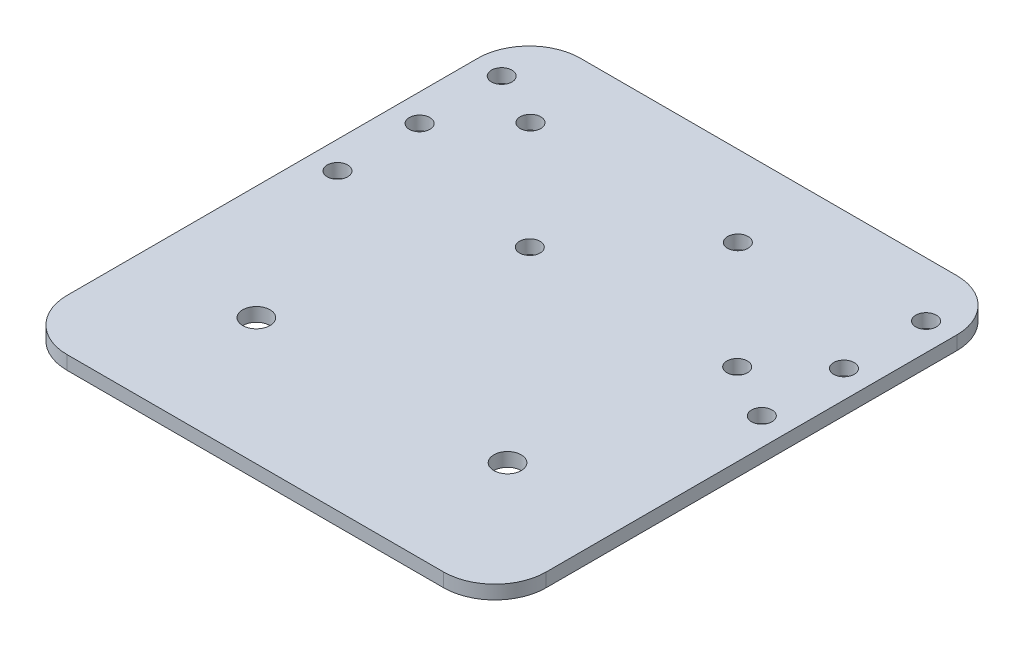
ISO-10303-21;
HEADER;
FILE_DESCRIPTION(('STEP AP214'),'2;1');
FILE_NAME('part.step','',(''),(''),'','','');
FILE_SCHEMA(('AUTOMOTIVE_DESIGN { 1 0 10303 214 1 1 1 1 }'));
ENDSEC;
DATA;
#1=APPLICATION_CONTEXT('core data for automotive mechanical design processes');
#2=APPLICATION_PROTOCOL_DEFINITION('international standard','automotive_design',2000,#1);
#3=PRODUCT_CONTEXT('',#1,'mechanical');
#4=PRODUCT('Part','Part','',(#3));
#5=PRODUCT_RELATED_PRODUCT_CATEGORY('part','',(#4));
#6=PRODUCT_DEFINITION_FORMATION('','',#4);
#7=PRODUCT_DEFINITION_CONTEXT('part definition',#1,'design');
#8=PRODUCT_DEFINITION('design','',#6,#7);
#9=PRODUCT_DEFINITION_SHAPE('','',#8);
#10=(LENGTH_UNIT() NAMED_UNIT(*) SI_UNIT(.MILLI.,.METRE.));
#11=(NAMED_UNIT(*) PLANE_ANGLE_UNIT() SI_UNIT($,.RADIAN.));
#12=(NAMED_UNIT(*) SI_UNIT($,.STERADIAN.) SOLID_ANGLE_UNIT());
#13=UNCERTAINTY_MEASURE_WITH_UNIT(LENGTH_MEASURE(1.E-05),#10,'distance_accuracy_value','');
#14=(GEOMETRIC_REPRESENTATION_CONTEXT(3) GLOBAL_UNCERTAINTY_ASSIGNED_CONTEXT((#13)) GLOBAL_UNIT_ASSIGNED_CONTEXT((#10,
#11,#12)) REPRESENTATION_CONTEXT('',''));
#15=CARTESIAN_POINT('',(0.,0.,0.));
#16=DIRECTION('',(0.,0.,1.));
#17=DIRECTION('',(1.,0.,0.));
#18=AXIS2_PLACEMENT_3D('',#15,#16,#17);
#19=CARTESIAN_POINT('',(0.,2.,0.));
#20=DIRECTION('',(0.,1.,0.));
#21=DIRECTION('',(0.,0.,1.));
#22=AXIS2_PLACEMENT_3D('',#19,#20,#21);
#23=PLANE('',#22);
#24=CARTESIAN_POINT('',(18.35,2.,20.));
#25=DIRECTION('',(0.,1.,0.));
#26=DIRECTION('',(0.,0.,1.));
#27=AXIS2_PLACEMENT_3D('',#24,#25,#26);
#28=CIRCLE('',#27,2.);
#29=CARTESIAN_POINT('',(18.35,2.,22.));
#30=VERTEX_POINT('',#29);
#31=EDGE_CURVE('E277',#30,#30,#28,.T.);
#32=ORIENTED_EDGE('',*,*,#31,.F.);
#33=EDGE_LOOP('',(#32));
#34=FACE_BOUND('',#33,.T.);
#35=CARTESIAN_POINT('',(-31.,2.,-16.5));
#36=DIRECTION('',(0.,1.,0.));
#37=DIRECTION('',(0.,0.,-1.));
#38=AXIS2_PLACEMENT_3D('',#35,#36,#37);
#39=CIRCLE('',#38,1.5);
#40=CARTESIAN_POINT('',(-31.,2.,-18.));
#41=VERTEX_POINT('',#40);
#42=EDGE_CURVE('E261',#41,#41,#39,.T.);
#43=ORIENTED_EDGE('',*,*,#42,.F.);
#44=EDGE_LOOP('',(#43));
#45=FACE_BOUND('',#44,.T.);
#46=CARTESIAN_POINT('',(31.,2.,-4.5));
#47=DIRECTION('',(0.,1.,0.));
#48=DIRECTION('',(0.,0.,1.));
#49=AXIS2_PLACEMENT_3D('',#46,#47,#48);
#50=CIRCLE('',#49,1.5);
#51=CARTESIAN_POINT('',(31.,2.,-3.));
#52=VERTEX_POINT('',#51);
#53=EDGE_CURVE('E245',#52,#52,#50,.T.);
#54=ORIENTED_EDGE('',*,*,#53,.F.);
#55=EDGE_LOOP('',(#54));
#56=FACE_BOUND('',#55,.T.);
#57=CARTESIAN_POINT('',(31.,2.,-16.5));
#58=DIRECTION('',(0.,1.,0.));
#59=DIRECTION('',(0.,0.,1.));
#60=AXIS2_PLACEMENT_3D('',#57,#58,#59);
#61=CIRCLE('',#60,1.5);
#62=CARTESIAN_POINT('',(31.,2.,-15.));
#63=VERTEX_POINT('',#62);
#64=EDGE_CURVE('E229',#63,#63,#61,.T.);
#65=ORIENTED_EDGE('',*,*,#64,.F.);
#66=EDGE_LOOP('',(#65));
#67=FACE_BOUND('',#66,.T.);
#68=CARTESIAN_POINT('',(-23.,2.,-24.7));
#69=DIRECTION('',(0.,1.,0.));
#70=DIRECTION('',(0.,0.,1.));
#71=AXIS2_PLACEMENT_3D('',#68,#69,#70);
#72=CIRCLE('',#71,1.5);
#73=CARTESIAN_POINT('',(-23.,2.,-23.2));
#74=VERTEX_POINT('',#73);
#75=EDGE_CURVE('E213',#74,#74,#72,.T.);
#76=ORIENTED_EDGE('',*,*,#75,.F.);
#77=EDGE_LOOP('',(#76));
#78=FACE_BOUND('',#77,.T.);
#79=CARTESIAN_POINT('',(7.3,2.,-24.7));
#80=DIRECTION('',(0.,1.,0.));
#81=DIRECTION('',(0.,0.,1.));
#82=AXIS2_PLACEMENT_3D('',#79,#80,#81);
#83=CIRCLE('',#82,1.5);
#84=CARTESIAN_POINT('',(7.3,2.,-23.2));
#85=VERTEX_POINT('',#84);
#86=EDGE_CURVE('E197',#85,#85,#83,.T.);
#87=ORIENTED_EDGE('',*,*,#86,.F.);
#88=EDGE_LOOP('',(#87));
#89=FACE_BOUND('',#88,.T.);
#90=DIRECTION('',(1.,0.,0.));
#91=VECTOR('',#90,1.);
#92=CARTESIAN_POINT('',(-35.,2.,38.5));
#93=LINE('',#92,#91);
#94=CARTESIAN_POINT('',(-27.5,2.,38.5));
#95=VERTEX_POINT('',#94);
#96=CARTESIAN_POINT('',(27.5,2.,38.5));
#97=VERTEX_POINT('',#96);
#98=EDGE_CURVE('E183',#95,#97,#93,.T.);
#99=ORIENTED_EDGE('',*,*,#98,.T.);
#100=CARTESIAN_POINT('',(27.5,2.,31.));
#101=DIRECTION('',(0.,1.,0.));
#102=DIRECTION('',(0.,0.,1.));
#103=AXIS2_PLACEMENT_3D('',#100,#101,#102);
#104=CIRCLE('',#103,7.5);
#105=CARTESIAN_POINT('',(35.,2.,31.));
#106=VERTEX_POINT('',#105);
#107=EDGE_CURVE('E169',#97,#106,#104,.T.);
#108=ORIENTED_EDGE('',*,*,#107,.T.);
#109=DIRECTION('',(0.,0.,-1.));
#110=VECTOR('',#109,1.);
#111=CARTESIAN_POINT('',(35.,2.,-36.5));
#112=LINE('',#111,#110);
#113=CARTESIAN_POINT('',(35.,2.,-29.));
#114=VERTEX_POINT('',#113);
#115=EDGE_CURVE('E126',#106,#114,#112,.T.);
#116=ORIENTED_EDGE('',*,*,#115,.T.);
#117=CARTESIAN_POINT('',(27.5,2.,-29.));
#118=DIRECTION('',(0.,1.,0.));
#119=DIRECTION('',(0.,0.,1.));
#120=AXIS2_PLACEMENT_3D('',#117,#118,#119);
#121=CIRCLE('',#120,7.5);
#122=CARTESIAN_POINT('',(27.5,2.,-36.5));
#123=VERTEX_POINT('',#122);
#124=EDGE_CURVE('E61',#114,#123,#121,.T.);
#125=ORIENTED_EDGE('',*,*,#124,.T.);
#126=DIRECTION('',(-1.,0.,0.));
#127=VECTOR('',#126,1.);
#128=CARTESIAN_POINT('',(35.,2.,-36.5));
#129=LINE('',#128,#127);
#130=CARTESIAN_POINT('',(-27.5,2.,-36.5));
#131=VERTEX_POINT('',#130);
#132=EDGE_CURVE('E148',#123,#131,#129,.T.);
#133=ORIENTED_EDGE('',*,*,#132,.T.);
#134=CARTESIAN_POINT('',(-27.5,2.,-29.));
#135=DIRECTION('',(0.,1.,0.));
#136=DIRECTION('',(0.,0.,1.));
#137=AXIS2_PLACEMENT_3D('',#134,#135,#136);
#138=CIRCLE('',#137,7.5);
#139=CARTESIAN_POINT('',(-35.,2.,-29.));
#140=VERTEX_POINT('',#139);
#141=EDGE_CURVE('E161',#131,#140,#138,.T.);
#142=ORIENTED_EDGE('',*,*,#141,.T.);
#143=DIRECTION('',(0.,0.,1.));
#144=VECTOR('',#143,1.);
#145=CARTESIAN_POINT('',(-35.,2.,-36.5));
#146=LINE('',#145,#144);
#147=CARTESIAN_POINT('',(-35.,2.,31.));
#148=VERTEX_POINT('',#147);
#149=EDGE_CURVE('E141',#140,#148,#146,.T.);
#150=ORIENTED_EDGE('',*,*,#149,.T.);
#151=CARTESIAN_POINT('',(-27.5,2.,31.));
#152=DIRECTION('',(0.,1.,0.));
#153=DIRECTION('',(0.,0.,1.));
#154=AXIS2_PLACEMENT_3D('',#151,#152,#153);
#155=CIRCLE('',#154,7.5);
#156=EDGE_CURVE('E166',#148,#95,#155,.T.);
#157=ORIENTED_EDGE('',*,*,#156,.T.);
#158=EDGE_LOOP('',(#99,#108,#116,#125,#133,#142,#150,#157));
#159=FACE_BOUND('',#158,.T.);
#160=CARTESIAN_POINT('',(23.,2.,-8.9));
#161=DIRECTION('',(0.,1.,0.));
#162=DIRECTION('',(0.,0.,1.));
#163=AXIS2_PLACEMENT_3D('',#160,#161,#162);
#164=CIRCLE('',#163,1.5);
#165=CARTESIAN_POINT('',(23.,2.,-7.4));
#166=VERTEX_POINT('',#165);
#167=EDGE_CURVE('E207',#166,#166,#164,.T.);
#168=ORIENTED_EDGE('',*,*,#167,.F.);
#169=EDGE_LOOP('',(#168));
#170=FACE_BOUND('',#169,.T.);
#171=CARTESIAN_POINT('',(-7.3,2.,-8.9));
#172=DIRECTION('',(0.,1.,0.));
#173=DIRECTION('',(0.,0.,1.));
#174=AXIS2_PLACEMENT_3D('',#171,#172,#173);
#175=CIRCLE('',#174,1.5);
#176=CARTESIAN_POINT('',(-7.3,2.,-7.4));
#177=VERTEX_POINT('',#176);
#178=EDGE_CURVE('E221',#177,#177,#175,.T.);
#179=ORIENTED_EDGE('',*,*,#178,.F.);
#180=EDGE_LOOP('',(#179));
#181=FACE_BOUND('',#180,.T.);
#182=CARTESIAN_POINT('',(31.,2.,-28.5));
#183=DIRECTION('',(0.,1.,0.));
#184=DIRECTION('',(0.,0.,1.));
#185=AXIS2_PLACEMENT_3D('',#182,#183,#184);
#186=CIRCLE('',#185,1.5);
#187=CARTESIAN_POINT('',(31.,2.,-27.));
#188=VERTEX_POINT('',#187);
#189=EDGE_CURVE('E237',#188,#188,#186,.T.);
#190=ORIENTED_EDGE('',*,*,#189,.F.);
#191=EDGE_LOOP('',(#190));
#192=FACE_BOUND('',#191,.T.);
#193=CARTESIAN_POINT('',(-31.,2.,-28.5));
#194=DIRECTION('',(0.,1.,0.));
#195=DIRECTION('',(0.,0.,-1.));
#196=AXIS2_PLACEMENT_3D('',#193,#194,#195);
#197=CIRCLE('',#196,1.5);
#198=CARTESIAN_POINT('',(-31.,2.,-30.));
#199=VERTEX_POINT('',#198);
#200=EDGE_CURVE('E253',#199,#199,#197,.T.);
#201=ORIENTED_EDGE('',*,*,#200,.F.);
#202=EDGE_LOOP('',(#201));
#203=FACE_BOUND('',#202,.T.);
#204=CARTESIAN_POINT('',(-31.,2.,-4.5));
#205=DIRECTION('',(0.,1.,0.));
#206=DIRECTION('',(0.,0.,-1.));
#207=AXIS2_PLACEMENT_3D('',#204,#205,#206);
#208=CIRCLE('',#207,1.5);
#209=CARTESIAN_POINT('',(-31.,2.,-6.));
#210=VERTEX_POINT('',#209);
#211=EDGE_CURVE('E269',#210,#210,#208,.T.);
#212=ORIENTED_EDGE('',*,*,#211,.F.);
#213=EDGE_LOOP('',(#212));
#214=FACE_BOUND('',#213,.T.);
#215=CARTESIAN_POINT('',(-18.35,2.,20.));
#216=DIRECTION('',(0.,1.,0.));
#217=DIRECTION('',(0.,0.,-1.));
#218=AXIS2_PLACEMENT_3D('',#215,#216,#217);
#219=CIRCLE('',#218,2.);
#220=CARTESIAN_POINT('',(-18.35,2.,18.));
#221=VERTEX_POINT('',#220);
#222=EDGE_CURVE('E285',#221,#221,#219,.T.);
#223=ORIENTED_EDGE('',*,*,#222,.F.);
#224=EDGE_LOOP('',(#223));
#225=FACE_BOUND('',#224,.T.);
#226=ADVANCED_FACE('F39',(#34,#45,#56,#67,#78,#89,#159,#170,#181,#192,#203,#214,#225),#23,.T.);
#227=CARTESIAN_POINT('',(0.,0.,0.));
#228=DIRECTION('',(0.,1.,0.));
#229=DIRECTION('',(0.,0.,1.));
#230=AXIS2_PLACEMENT_3D('',#227,#228,#229);
#231=PLANE('',#230);
#232=DIRECTION('',(0.,0.,-1.));
#233=VECTOR('',#232,1.);
#234=CARTESIAN_POINT('',(35.,0.,-36.5));
#235=LINE('',#234,#233);
#236=CARTESIAN_POINT('',(35.,0.,31.));
#237=VERTEX_POINT('',#236);
#238=CARTESIAN_POINT('',(35.,0.,-29.));
#239=VERTEX_POINT('',#238);
#240=EDGE_CURVE('E124',#237,#239,#235,.T.);
#241=ORIENTED_EDGE('',*,*,#240,.F.);
#242=CARTESIAN_POINT('',(27.5,0.,31.));
#243=DIRECTION('',(0.,1.,0.));
#244=DIRECTION('',(0.,0.,1.));
#245=AXIS2_PLACEMENT_3D('',#242,#243,#244);
#246=CIRCLE('',#245,7.5);
#247=CARTESIAN_POINT('',(27.5,0.,38.5));
#248=VERTEX_POINT('',#247);
#249=EDGE_CURVE('E106',#237,#248,#246,.F.);
#250=ORIENTED_EDGE('',*,*,#249,.T.);
#251=DIRECTION('',(1.,0.,0.));
#252=VECTOR('',#251,1.);
#253=CARTESIAN_POINT('',(-35.,0.,38.5));
#254=LINE('',#253,#252);
#255=CARTESIAN_POINT('',(-27.5,0.,38.5));
#256=VERTEX_POINT('',#255);
#257=EDGE_CURVE('E137',#256,#248,#254,.T.);
#258=ORIENTED_EDGE('',*,*,#257,.F.);
#259=CARTESIAN_POINT('',(-27.5,0.,31.));
#260=DIRECTION('',(0.,1.,0.));
#261=DIRECTION('',(0.,0.,1.));
#262=AXIS2_PLACEMENT_3D('',#259,#260,#261);
#263=CIRCLE('',#262,7.5);
#264=CARTESIAN_POINT('',(-35.,0.,31.));
#265=VERTEX_POINT('',#264);
#266=EDGE_CURVE('E118',#256,#265,#263,.F.);
#267=ORIENTED_EDGE('',*,*,#266,.T.);
#268=DIRECTION('',(0.,0.,1.));
#269=VECTOR('',#268,1.);
#270=CARTESIAN_POINT('',(-35.,0.,-36.5));
#271=LINE('',#270,#269);
#272=CARTESIAN_POINT('',(-35.,0.,-29.));
#273=VERTEX_POINT('',#272);
#274=EDGE_CURVE('E143',#273,#265,#271,.T.);
#275=ORIENTED_EDGE('',*,*,#274,.F.);
#276=CARTESIAN_POINT('',(-27.5,0.,-29.));
#277=DIRECTION('',(0.,1.,0.));
#278=DIRECTION('',(0.,0.,1.));
#279=AXIS2_PLACEMENT_3D('',#276,#277,#278);
#280=CIRCLE('',#279,7.5);
#281=CARTESIAN_POINT('',(-27.5,0.,-36.5));
#282=VERTEX_POINT('',#281);
#283=EDGE_CURVE('E128',#273,#282,#280,.F.);
#284=ORIENTED_EDGE('',*,*,#283,.T.);
#285=DIRECTION('',(-1.,0.,0.));
#286=VECTOR('',#285,1.);
#287=CARTESIAN_POINT('',(35.,0.,-36.5));
#288=LINE('',#287,#286);
#289=CARTESIAN_POINT('',(27.5,0.,-36.5));
#290=VERTEX_POINT('',#289);
#291=EDGE_CURVE('E136',#290,#282,#288,.T.);
#292=ORIENTED_EDGE('',*,*,#291,.F.);
#293=CARTESIAN_POINT('',(27.5,0.,-29.));
#294=DIRECTION('',(0.,1.,0.));
#295=DIRECTION('',(0.,0.,1.));
#296=AXIS2_PLACEMENT_3D('',#293,#294,#295);
#297=CIRCLE('',#296,7.5);
#298=EDGE_CURVE('E134',#290,#239,#297,.F.);
#299=ORIENTED_EDGE('',*,*,#298,.T.);
#300=EDGE_LOOP('',(#241,#250,#258,#267,#275,#284,#292,#299));
#301=FACE_BOUND('',#300,.T.);
#302=CARTESIAN_POINT('',(7.3,0.,-24.7));
#303=DIRECTION('',(0.,1.,0.));
#304=DIRECTION('',(0.,0.,1.));
#305=AXIS2_PLACEMENT_3D('',#302,#303,#304);
#306=CIRCLE('',#305,1.5);
#307=CARTESIAN_POINT('',(7.3,0.,-23.2));
#308=VERTEX_POINT('',#307);
#309=EDGE_CURVE('E193',#308,#308,#306,.T.);
#310=ORIENTED_EDGE('',*,*,#309,.T.);
#311=EDGE_LOOP('',(#310));
#312=FACE_BOUND('',#311,.T.);
#313=CARTESIAN_POINT('',(23.,0.,-8.9));
#314=DIRECTION('',(0.,1.,0.));
#315=DIRECTION('',(0.,0.,1.));
#316=AXIS2_PLACEMENT_3D('',#313,#314,#315);
#317=CIRCLE('',#316,1.5);
#318=CARTESIAN_POINT('',(23.,0.,-7.4));
#319=VERTEX_POINT('',#318);
#320=EDGE_CURVE('E209',#319,#319,#317,.T.);
#321=ORIENTED_EDGE('',*,*,#320,.T.);
#322=EDGE_LOOP('',(#321));
#323=FACE_BOUND('',#322,.T.);
#324=CARTESIAN_POINT('',(-23.,0.,-24.7));
#325=DIRECTION('',(0.,1.,0.));
#326=DIRECTION('',(0.,0.,1.));
#327=AXIS2_PLACEMENT_3D('',#324,#325,#326);
#328=CIRCLE('',#327,1.5);
#329=CARTESIAN_POINT('',(-23.,0.,-23.2));
#330=VERTEX_POINT('',#329);
#331=EDGE_CURVE('E217',#330,#330,#328,.T.);
#332=ORIENTED_EDGE('',*,*,#331,.T.);
#333=EDGE_LOOP('',(#332));
#334=FACE_BOUND('',#333,.T.);
#335=CARTESIAN_POINT('',(-7.3,0.,-8.9));
#336=DIRECTION('',(0.,1.,0.));
#337=DIRECTION('',(0.,0.,1.));
#338=AXIS2_PLACEMENT_3D('',#335,#336,#337);
#339=CIRCLE('',#338,1.5);
#340=CARTESIAN_POINT('',(-7.3,0.,-7.4));
#341=VERTEX_POINT('',#340);
#342=EDGE_CURVE('E225',#341,#341,#339,.T.);
#343=ORIENTED_EDGE('',*,*,#342,.T.);
#344=EDGE_LOOP('',(#343));
#345=FACE_BOUND('',#344,.T.);
#346=CARTESIAN_POINT('',(31.,0.,-16.5));
#347=DIRECTION('',(0.,1.,0.));
#348=DIRECTION('',(0.,0.,1.));
#349=AXIS2_PLACEMENT_3D('',#346,#347,#348);
#350=CIRCLE('',#349,1.5);
#351=CARTESIAN_POINT('',(31.,0.,-15.));
#352=VERTEX_POINT('',#351);
#353=EDGE_CURVE('E233',#352,#352,#350,.T.);
#354=ORIENTED_EDGE('',*,*,#353,.T.);
#355=EDGE_LOOP('',(#354));
#356=FACE_BOUND('',#355,.T.);
#357=CARTESIAN_POINT('',(31.,0.,-28.5));
#358=DIRECTION('',(0.,1.,0.));
#359=DIRECTION('',(0.,0.,1.));
#360=AXIS2_PLACEMENT_3D('',#357,#358,#359);
#361=CIRCLE('',#360,1.5);
#362=CARTESIAN_POINT('',(31.,0.,-27.));
#363=VERTEX_POINT('',#362);
#364=EDGE_CURVE('E241',#363,#363,#361,.T.);
#365=ORIENTED_EDGE('',*,*,#364,.T.);
#366=EDGE_LOOP('',(#365));
#367=FACE_BOUND('',#366,.T.);
#368=CARTESIAN_POINT('',(31.,0.,-4.5));
#369=DIRECTION('',(0.,1.,0.));
#370=DIRECTION('',(0.,0.,1.));
#371=AXIS2_PLACEMENT_3D('',#368,#369,#370);
#372=CIRCLE('',#371,1.5);
#373=CARTESIAN_POINT('',(31.,0.,-3.));
#374=VERTEX_POINT('',#373);
#375=EDGE_CURVE('E249',#374,#374,#372,.T.);
#376=ORIENTED_EDGE('',*,*,#375,.T.);
#377=EDGE_LOOP('',(#376));
#378=FACE_BOUND('',#377,.T.);
#379=CARTESIAN_POINT('',(-31.,0.,-28.5));
#380=DIRECTION('',(0.,1.,0.));
#381=DIRECTION('',(0.,0.,-1.));
#382=AXIS2_PLACEMENT_3D('',#379,#380,#381);
#383=CIRCLE('',#382,1.5);
#384=CARTESIAN_POINT('',(-31.,0.,-30.));
#385=VERTEX_POINT('',#384);
#386=EDGE_CURVE('E257',#385,#385,#383,.T.);
#387=ORIENTED_EDGE('',*,*,#386,.T.);
#388=EDGE_LOOP('',(#387));
#389=FACE_BOUND('',#388,.T.);
#390=CARTESIAN_POINT('',(-31.,0.,-16.5));
#391=DIRECTION('',(0.,1.,0.));
#392=DIRECTION('',(0.,0.,-1.));
#393=AXIS2_PLACEMENT_3D('',#390,#391,#392);
#394=CIRCLE('',#393,1.5);
#395=CARTESIAN_POINT('',(-31.,0.,-18.));
#396=VERTEX_POINT('',#395);
#397=EDGE_CURVE('E265',#396,#396,#394,.T.);
#398=ORIENTED_EDGE('',*,*,#397,.T.);
#399=EDGE_LOOP('',(#398));
#400=FACE_BOUND('',#399,.T.);
#401=CARTESIAN_POINT('',(-31.,0.,-4.5));
#402=DIRECTION('',(0.,1.,0.));
#403=DIRECTION('',(0.,0.,-1.));
#404=AXIS2_PLACEMENT_3D('',#401,#402,#403);
#405=CIRCLE('',#404,1.5);
#406=CARTESIAN_POINT('',(-31.,0.,-6.));
#407=VERTEX_POINT('',#406);
#408=EDGE_CURVE('E273',#407,#407,#405,.T.);
#409=ORIENTED_EDGE('',*,*,#408,.T.);
#410=EDGE_LOOP('',(#409));
#411=FACE_BOUND('',#410,.T.);
#412=CARTESIAN_POINT('',(18.35,0.,20.));
#413=DIRECTION('',(0.,1.,0.));
#414=DIRECTION('',(0.,0.,1.));
#415=AXIS2_PLACEMENT_3D('',#412,#413,#414);
#416=CIRCLE('',#415,2.);
#417=CARTESIAN_POINT('',(18.35,0.,22.));
#418=VERTEX_POINT('',#417);
#419=EDGE_CURVE('E281',#418,#418,#416,.T.);
#420=ORIENTED_EDGE('',*,*,#419,.T.);
#421=EDGE_LOOP('',(#420));
#422=FACE_BOUND('',#421,.T.);
#423=CARTESIAN_POINT('',(-18.35,0.,20.));
#424=DIRECTION('',(0.,1.,0.));
#425=DIRECTION('',(0.,0.,-1.));
#426=AXIS2_PLACEMENT_3D('',#423,#424,#425);
#427=CIRCLE('',#426,2.);
#428=CARTESIAN_POINT('',(-18.35,0.,18.));
#429=VERTEX_POINT('',#428);
#430=EDGE_CURVE('E289',#429,#429,#427,.T.);
#431=ORIENTED_EDGE('',*,*,#430,.T.);
#432=EDGE_LOOP('',(#431));
#433=FACE_BOUND('',#432,.T.);
#434=ADVANCED_FACE('F131',(#301,#312,#323,#334,#345,#356,#367,#378,#389,#400,#411,#422,#433),
#231,.F.);
#435=CARTESIAN_POINT('',(-35.,2.,-36.5));
#436=DIRECTION('',(1.,0.,0.));
#437=DIRECTION('',(0.,0.,-1.));
#438=AXIS2_PLACEMENT_3D('',#435,#436,#437);
#439=PLANE('',#438);
#440=ORIENTED_EDGE('',*,*,#274,.T.);
#441=DIRECTION('',(0.,-1.,0.));
#442=VECTOR('',#441,1.);
#443=CARTESIAN_POINT('',(-35.,2.,31.));
#444=LINE('',#443,#442);
#445=EDGE_CURVE('E176',#265,#148,#444,.F.);
#446=ORIENTED_EDGE('',*,*,#445,.T.);
#447=ORIENTED_EDGE('',*,*,#149,.F.);
#448=DIRECTION('',(0.,-1.,0.));
#449=VECTOR('',#448,1.);
#450=CARTESIAN_POINT('',(-35.,2.,-29.));
#451=LINE('',#450,#449);
#452=EDGE_CURVE('E172',#140,#273,#451,.T.);
#453=ORIENTED_EDGE('',*,*,#452,.T.);
#454=EDGE_LOOP('',(#440,#446,#447,#453));
#455=FACE_BOUND('',#454,.T.);
#456=ADVANCED_FACE('F306',(#455),#439,.F.);
#457=CARTESIAN_POINT('',(-35.,2.,38.5));
#458=DIRECTION('',(0.,0.,-1.));
#459=DIRECTION('',(-1.,0.,0.));
#460=AXIS2_PLACEMENT_3D('',#457,#458,#459);
#461=PLANE('',#460);
#462=ORIENTED_EDGE('',*,*,#257,.T.);
#463=DIRECTION('',(0.,-1.,0.));
#464=VECTOR('',#463,1.);
#465=CARTESIAN_POINT('',(27.5,2.,38.5));
#466=LINE('',#465,#464);
#467=EDGE_CURVE('E111',#248,#97,#466,.F.);
#468=ORIENTED_EDGE('',*,*,#467,.T.);
#469=ORIENTED_EDGE('',*,*,#98,.F.);
#470=DIRECTION('',(0.,-1.,0.));
#471=VECTOR('',#470,1.);
#472=CARTESIAN_POINT('',(-27.5,2.,38.5));
#473=LINE('',#472,#471);
#474=EDGE_CURVE('E117',#95,#256,#473,.T.);
#475=ORIENTED_EDGE('',*,*,#474,.T.);
#476=EDGE_LOOP('',(#462,#468,#469,#475));
#477=FACE_BOUND('',#476,.T.);
#478=ADVANCED_FACE('F319',(#477),#461,.F.);
#479=CARTESIAN_POINT('',(35.,2.,-36.5));
#480=DIRECTION('',(-1.,0.,0.));
#481=DIRECTION('',(0.,0.,1.));
#482=AXIS2_PLACEMENT_3D('',#479,#480,#481);
#483=PLANE('',#482);
#484=ORIENTED_EDGE('',*,*,#115,.F.);
#485=DIRECTION('',(0.,-1.,0.));
#486=VECTOR('',#485,1.);
#487=CARTESIAN_POINT('',(35.,2.,31.));
#488=LINE('',#487,#486);
#489=EDGE_CURVE('E110',#106,#237,#488,.T.);
#490=ORIENTED_EDGE('',*,*,#489,.T.);
#491=ORIENTED_EDGE('',*,*,#240,.T.);
#492=DIRECTION('',(0.,-1.,0.));
#493=VECTOR('',#492,1.);
#494=CARTESIAN_POINT('',(35.,2.,-29.));
#495=LINE('',#494,#493);
#496=EDGE_CURVE('E129',#239,#114,#495,.F.);
#497=ORIENTED_EDGE('',*,*,#496,.T.);
#498=EDGE_LOOP('',(#484,#490,#491,#497));
#499=FACE_BOUND('',#498,.T.);
#500=ADVANCED_FACE('F123',(#499),#483,.F.);
#501=CARTESIAN_POINT('',(35.,2.,-36.5));
#502=DIRECTION('',(0.,0.,1.));
#503=DIRECTION('',(1.,0.,0.));
#504=AXIS2_PLACEMENT_3D('',#501,#502,#503);
#505=PLANE('',#504);
#506=ORIENTED_EDGE('',*,*,#132,.F.);
#507=DIRECTION('',(0.,-1.,0.));
#508=VECTOR('',#507,1.);
#509=CARTESIAN_POINT('',(27.5,2.,-36.5));
#510=LINE('',#509,#508);
#511=EDGE_CURVE('E11',#123,#290,#510,.T.);
#512=ORIENTED_EDGE('',*,*,#511,.T.);
#513=ORIENTED_EDGE('',*,*,#291,.T.);
#514=DIRECTION('',(0.,-1.,0.));
#515=VECTOR('',#514,1.);
#516=CARTESIAN_POINT('',(-27.5,2.,-36.5));
#517=LINE('',#516,#515);
#518=EDGE_CURVE('E48',#282,#131,#517,.F.);
#519=ORIENTED_EDGE('',*,*,#518,.T.);
#520=EDGE_LOOP('',(#506,#512,#513,#519));
#521=FACE_BOUND('',#520,.T.);
#522=ADVANCED_FACE('F314',(#521),#505,.F.);
#523=CARTESIAN_POINT('',(7.3,2.,-24.7));
#524=DIRECTION('',(0.,-1.,0.));
#525=DIRECTION('',(0.,0.,-1.));
#526=AXIS2_PLACEMENT_3D('',#523,#524,#525);
#527=CYLINDRICAL_SURFACE('',#526,1.5);
#528=ORIENTED_EDGE('',*,*,#86,.T.);
#529=EDGE_LOOP('',(#528));
#530=FACE_BOUND('',#529,.T.);
#531=ORIENTED_EDGE('',*,*,#309,.F.);
#532=EDGE_LOOP('',(#531));
#533=FACE_BOUND('',#532,.T.);
#534=ADVANCED_FACE('F311',(#530,#533),#527,.F.);
#535=CARTESIAN_POINT('',(23.,2.,-8.9));
#536=DIRECTION('',(0.,-1.,0.));
#537=DIRECTION('',(0.,0.,-1.));
#538=AXIS2_PLACEMENT_3D('',#535,#536,#537);
#539=CYLINDRICAL_SURFACE('',#538,1.5);
#540=ORIENTED_EDGE('',*,*,#167,.T.);
#541=EDGE_LOOP('',(#540));
#542=FACE_BOUND('',#541,.T.);
#543=ORIENTED_EDGE('',*,*,#320,.F.);
#544=EDGE_LOOP('',(#543));
#545=FACE_BOUND('',#544,.T.);
#546=ADVANCED_FACE('F398',(#542,#545),#539,.F.);
#547=CARTESIAN_POINT('',(-23.,2.,-24.7));
#548=DIRECTION('',(0.,-1.,0.));
#549=DIRECTION('',(0.,0.,-1.));
#550=AXIS2_PLACEMENT_3D('',#547,#548,#549);
#551=CYLINDRICAL_SURFACE('',#550,1.5);
#552=ORIENTED_EDGE('',*,*,#75,.T.);
#553=EDGE_LOOP('',(#552));
#554=FACE_BOUND('',#553,.T.);
#555=ORIENTED_EDGE('',*,*,#331,.F.);
#556=EDGE_LOOP('',(#555));
#557=FACE_BOUND('',#556,.T.);
#558=ADVANCED_FACE('F395',(#554,#557),#551,.F.);
#559=CARTESIAN_POINT('',(-7.3,2.,-8.9));
#560=DIRECTION('',(0.,-1.,0.));
#561=DIRECTION('',(0.,0.,-1.));
#562=AXIS2_PLACEMENT_3D('',#559,#560,#561);
#563=CYLINDRICAL_SURFACE('',#562,1.5);
#564=ORIENTED_EDGE('',*,*,#178,.T.);
#565=EDGE_LOOP('',(#564));
#566=FACE_BOUND('',#565,.T.);
#567=ORIENTED_EDGE('',*,*,#342,.F.);
#568=EDGE_LOOP('',(#567));
#569=FACE_BOUND('',#568,.T.);
#570=ADVANCED_FACE('F391',(#566,#569),#563,.F.);
#571=CARTESIAN_POINT('',(31.,2.,-16.5));
#572=DIRECTION('',(0.,-1.,0.));
#573=DIRECTION('',(0.,0.,-1.));
#574=AXIS2_PLACEMENT_3D('',#571,#572,#573);
#575=CYLINDRICAL_SURFACE('',#574,1.5);
#576=ORIENTED_EDGE('',*,*,#64,.T.);
#577=EDGE_LOOP('',(#576));
#578=FACE_BOUND('',#577,.T.);
#579=ORIENTED_EDGE('',*,*,#353,.F.);
#580=EDGE_LOOP('',(#579));
#581=FACE_BOUND('',#580,.T.);
#582=ADVANCED_FACE('F387',(#578,#581),#575,.F.);
#583=CARTESIAN_POINT('',(31.,2.,-28.5));
#584=DIRECTION('',(0.,-1.,0.));
#585=DIRECTION('',(0.,0.,-1.));
#586=AXIS2_PLACEMENT_3D('',#583,#584,#585);
#587=CYLINDRICAL_SURFACE('',#586,1.5);
#588=ORIENTED_EDGE('',*,*,#189,.T.);
#589=EDGE_LOOP('',(#588));
#590=FACE_BOUND('',#589,.T.);
#591=ORIENTED_EDGE('',*,*,#364,.F.);
#592=EDGE_LOOP('',(#591));
#593=FACE_BOUND('',#592,.T.);
#594=ADVANCED_FACE('F383',(#590,#593),#587,.F.);
#595=CARTESIAN_POINT('',(31.,2.,-4.5));
#596=DIRECTION('',(0.,-1.,0.));
#597=DIRECTION('',(0.,0.,-1.));
#598=AXIS2_PLACEMENT_3D('',#595,#596,#597);
#599=CYLINDRICAL_SURFACE('',#598,1.5);
#600=ORIENTED_EDGE('',*,*,#53,.T.);
#601=EDGE_LOOP('',(#600));
#602=FACE_BOUND('',#601,.T.);
#603=ORIENTED_EDGE('',*,*,#375,.F.);
#604=EDGE_LOOP('',(#603));
#605=FACE_BOUND('',#604,.T.);
#606=ADVANCED_FACE('F379',(#602,#605),#599,.F.);
#607=CARTESIAN_POINT('',(-31.,2.,-28.5));
#608=DIRECTION('',(0.,-1.,0.));
#609=DIRECTION('',(0.,0.,-1.));
#610=AXIS2_PLACEMENT_3D('',#607,#608,#609);
#611=CYLINDRICAL_SURFACE('',#610,1.5);
#612=ORIENTED_EDGE('',*,*,#200,.T.);
#613=EDGE_LOOP('',(#612));
#614=FACE_BOUND('',#613,.T.);
#615=ORIENTED_EDGE('',*,*,#386,.F.);
#616=EDGE_LOOP('',(#615));
#617=FACE_BOUND('',#616,.T.);
#618=ADVANCED_FACE('F375',(#614,#617),#611,.F.);
#619=CARTESIAN_POINT('',(-31.,2.,-16.5));
#620=DIRECTION('',(0.,-1.,0.));
#621=DIRECTION('',(0.,0.,-1.));
#622=AXIS2_PLACEMENT_3D('',#619,#620,#621);
#623=CYLINDRICAL_SURFACE('',#622,1.5);
#624=ORIENTED_EDGE('',*,*,#42,.T.);
#625=EDGE_LOOP('',(#624));
#626=FACE_BOUND('',#625,.T.);
#627=ORIENTED_EDGE('',*,*,#397,.F.);
#628=EDGE_LOOP('',(#627));
#629=FACE_BOUND('',#628,.T.);
#630=ADVANCED_FACE('F357',(#626,#629),#623,.F.);
#631=CARTESIAN_POINT('',(-31.,2.,-4.5));
#632=DIRECTION('',(0.,-1.,0.));
#633=DIRECTION('',(0.,0.,-1.));
#634=AXIS2_PLACEMENT_3D('',#631,#632,#633);
#635=CYLINDRICAL_SURFACE('',#634,1.5);
#636=ORIENTED_EDGE('',*,*,#211,.T.);
#637=EDGE_LOOP('',(#636));
#638=FACE_BOUND('',#637,.T.);
#639=ORIENTED_EDGE('',*,*,#408,.F.);
#640=EDGE_LOOP('',(#639));
#641=FACE_BOUND('',#640,.T.);
#642=ADVANCED_FACE('F353',(#638,#641),#635,.F.);
#643=CARTESIAN_POINT('',(18.35,2.,20.));
#644=DIRECTION('',(0.,-1.,0.));
#645=DIRECTION('',(0.,0.,-1.));
#646=AXIS2_PLACEMENT_3D('',#643,#644,#645);
#647=CYLINDRICAL_SURFACE('',#646,2.);
#648=ORIENTED_EDGE('',*,*,#31,.T.);
#649=EDGE_LOOP('',(#648));
#650=FACE_BOUND('',#649,.T.);
#651=ORIENTED_EDGE('',*,*,#419,.F.);
#652=EDGE_LOOP('',(#651));
#653=FACE_BOUND('',#652,.T.);
#654=ADVANCED_FACE('F356',(#650,#653),#647,.F.);
#655=CARTESIAN_POINT('',(-18.35,2.,20.));
#656=DIRECTION('',(0.,-1.,0.));
#657=DIRECTION('',(0.,0.,-1.));
#658=AXIS2_PLACEMENT_3D('',#655,#656,#657);
#659=CYLINDRICAL_SURFACE('',#658,2.);
#660=ORIENTED_EDGE('',*,*,#222,.T.);
#661=EDGE_LOOP('',(#660));
#662=FACE_BOUND('',#661,.T.);
#663=ORIENTED_EDGE('',*,*,#430,.F.);
#664=EDGE_LOOP('',(#663));
#665=FACE_BOUND('',#664,.T.);
#666=ADVANCED_FACE('F297',(#662,#665),#659,.F.);
#667=CARTESIAN_POINT('',(27.5,2.,31.));
#668=DIRECTION('',(0.,-1.,0.));
#669=DIRECTION('',(0.,0.,-1.));
#670=AXIS2_PLACEMENT_3D('',#667,#668,#669);
#671=CYLINDRICAL_SURFACE('',#670,7.5);
#672=ORIENTED_EDGE('',*,*,#107,.F.);
#673=ORIENTED_EDGE('',*,*,#467,.F.);
#674=ORIENTED_EDGE('',*,*,#249,.F.);
#675=ORIENTED_EDGE('',*,*,#489,.F.);
#676=EDGE_LOOP('',(#672,#673,#674,#675));
#677=FACE_BOUND('',#676,.T.);
#678=ADVANCED_FACE('F109',(#677),#671,.T.);
#679=CARTESIAN_POINT('',(-27.5,2.,31.));
#680=DIRECTION('',(0.,-1.,0.));
#681=DIRECTION('',(0.,0.,-1.));
#682=AXIS2_PLACEMENT_3D('',#679,#680,#681);
#683=CYLINDRICAL_SURFACE('',#682,7.5);
#684=ORIENTED_EDGE('',*,*,#156,.F.);
#685=ORIENTED_EDGE('',*,*,#445,.F.);
#686=ORIENTED_EDGE('',*,*,#266,.F.);
#687=ORIENTED_EDGE('',*,*,#474,.F.);
#688=EDGE_LOOP('',(#684,#685,#686,#687));
#689=FACE_BOUND('',#688,.T.);
#690=ADVANCED_FACE('F327',(#689),#683,.T.);
#691=CARTESIAN_POINT('',(27.5,2.,-29.));
#692=DIRECTION('',(0.,-1.,0.));
#693=DIRECTION('',(0.,0.,-1.));
#694=AXIS2_PLACEMENT_3D('',#691,#692,#693);
#695=CYLINDRICAL_SURFACE('',#694,7.5);
#696=ORIENTED_EDGE('',*,*,#124,.F.);
#697=ORIENTED_EDGE('',*,*,#496,.F.);
#698=ORIENTED_EDGE('',*,*,#298,.F.);
#699=ORIENTED_EDGE('',*,*,#511,.F.);
#700=EDGE_LOOP('',(#696,#697,#698,#699));
#701=FACE_BOUND('',#700,.T.);
#702=ADVANCED_FACE('F329',(#701),#695,.T.);
#703=CARTESIAN_POINT('',(-27.5,2.,-29.));
#704=DIRECTION('',(0.,-1.,0.));
#705=DIRECTION('',(0.,0.,-1.));
#706=AXIS2_PLACEMENT_3D('',#703,#704,#705);
#707=CYLINDRICAL_SURFACE('',#706,7.5);
#708=ORIENTED_EDGE('',*,*,#141,.F.);
#709=ORIENTED_EDGE('',*,*,#518,.F.);
#710=ORIENTED_EDGE('',*,*,#283,.F.);
#711=ORIENTED_EDGE('',*,*,#452,.F.);
#712=EDGE_LOOP('',(#708,#709,#710,#711));
#713=FACE_BOUND('',#712,.T.);
#714=ADVANCED_FACE('F41',(#713),#707,.T.);
#715=CLOSED_SHELL('',(#226,#434,#456,#478,#500,#522,#534,#546,#558,#570,#582,#594,#606,#618,
#630,#642,#654,#666,#678,#690,#702,#714));
#716=MANIFOLD_SOLID_BREP('B2',#715);
#717=ADVANCED_BREP_SHAPE_REPRESENTATION('',(#18,#716),#14);
#718=SHAPE_DEFINITION_REPRESENTATION(#9,#717);
ENDSEC;
END-ISO-10303-21;
